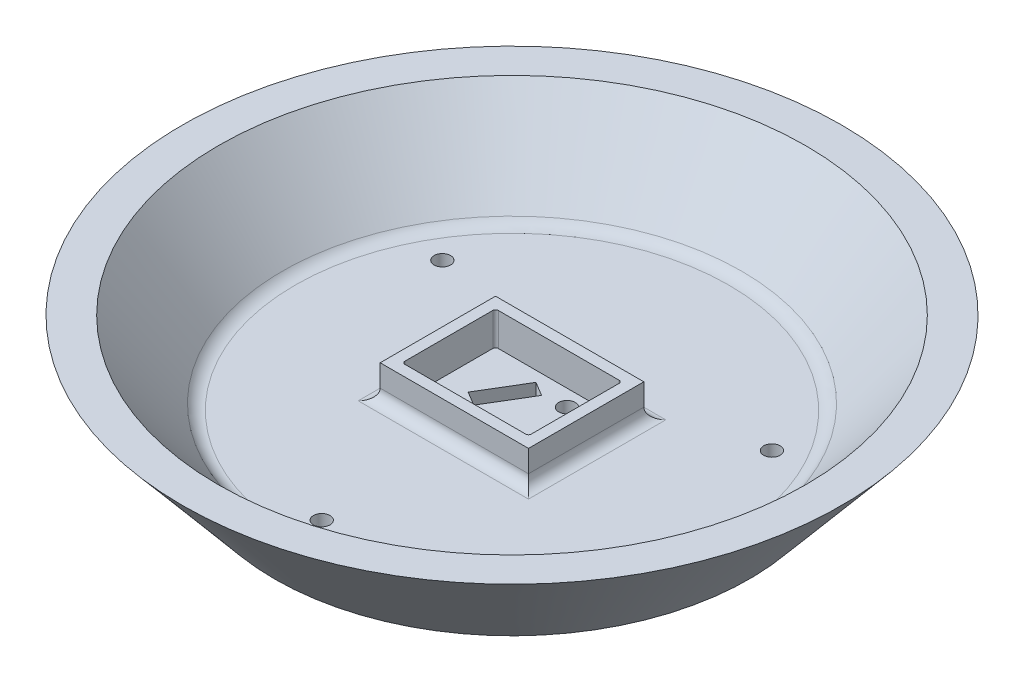
ISO-10303-21;
HEADER;
FILE_DESCRIPTION(('STEP AP214'),'2;1');
FILE_NAME('part.step','',(''),(''),'','','');
FILE_SCHEMA(('AUTOMOTIVE_DESIGN { 1 0 10303 214 1 1 1 1 }'));
ENDSEC;
DATA;
#1=APPLICATION_CONTEXT('core data for automotive mechanical design processes');
#2=APPLICATION_PROTOCOL_DEFINITION('international standard','automotive_design',2000,#1);
#3=PRODUCT_CONTEXT('',#1,'mechanical');
#4=PRODUCT('Part','Part','',(#3));
#5=PRODUCT_RELATED_PRODUCT_CATEGORY('part','',(#4));
#6=PRODUCT_DEFINITION_FORMATION('','',#4);
#7=PRODUCT_DEFINITION_CONTEXT('part definition',#1,'design');
#8=PRODUCT_DEFINITION('design','',#6,#7);
#9=PRODUCT_DEFINITION_SHAPE('','',#8);
#10=(LENGTH_UNIT() NAMED_UNIT(*) SI_UNIT(.MILLI.,.METRE.));
#11=(NAMED_UNIT(*) PLANE_ANGLE_UNIT() SI_UNIT($,.RADIAN.));
#12=(NAMED_UNIT(*) SI_UNIT($,.STERADIAN.) SOLID_ANGLE_UNIT());
#13=UNCERTAINTY_MEASURE_WITH_UNIT(LENGTH_MEASURE(1.E-05),#10,'distance_accuracy_value','');
#14=(GEOMETRIC_REPRESENTATION_CONTEXT(3) GLOBAL_UNCERTAINTY_ASSIGNED_CONTEXT((#13)) GLOBAL_UNIT_ASSIGNED_CONTEXT((#10,
#11,#12)) REPRESENTATION_CONTEXT('',''));
#15=CARTESIAN_POINT('',(0.,0.,0.));
#16=DIRECTION('',(0.,0.,1.));
#17=DIRECTION('',(1.,0.,0.));
#18=AXIS2_PLACEMENT_3D('',#15,#16,#17);
#19=CARTESIAN_POINT('',(0.,-15.,0.));
#20=DIRECTION('',(0.,1.,0.));
#21=DIRECTION('',(0.,0.,1.));
#22=AXIS2_PLACEMENT_3D('',#19,#20,#21);
#23=PLANE('',#22);
#24=CARTESIAN_POINT('',(0.,-15.,0.));
#25=DIRECTION('',(0.,1.,0.));
#26=DIRECTION('',(0.,0.,1.));
#27=AXIS2_PLACEMENT_3D('',#24,#25,#26);
#28=CIRCLE('',#27,39.4875461112144);
#29=CARTESIAN_POINT('',(0.,-15.,39.4875461112144));
#30=VERTEX_POINT('',#29);
#31=EDGE_CURVE('E43',#30,#30,#28,.T.);
#32=ORIENTED_EDGE('',*,*,#31,.T.);
#33=EDGE_LOOP('',(#32));
#34=FACE_BOUND('',#33,.T.);
#35=DIRECTION('',(0.,0.,1.));
#36=VECTOR('',#35,1.);
#37=CARTESIAN_POINT('',(-15.5,-15.,0.));
#38=LINE('',#37,#36);
#39=CARTESIAN_POINT('',(-15.5,-15.,12.5));
#40=VERTEX_POINT('',#39);
#41=CARTESIAN_POINT('',(-15.5,-15.,-12.5));
#42=VERTEX_POINT('',#41);
#43=EDGE_CURVE('E346',#40,#42,#38,.F.);
#44=ORIENTED_EDGE('',*,*,#43,.T.);
#45=DIRECTION('',(-1.,0.,0.));
#46=VECTOR('',#45,1.);
#47=CARTESIAN_POINT('',(0.,-15.,-12.5));
#48=LINE('',#47,#46);
#49=CARTESIAN_POINT('',(15.5,-15.,-12.5));
#50=VERTEX_POINT('',#49);
#51=EDGE_CURVE('E352',#42,#50,#48,.F.);
#52=ORIENTED_EDGE('',*,*,#51,.T.);
#53=DIRECTION('',(0.,0.,-1.));
#54=VECTOR('',#53,1.);
#55=CARTESIAN_POINT('',(15.5,-15.,0.));
#56=LINE('',#55,#54);
#57=CARTESIAN_POINT('',(15.5,-15.,12.5));
#58=VERTEX_POINT('',#57);
#59=EDGE_CURVE('E350',#50,#58,#56,.F.);
#60=ORIENTED_EDGE('',*,*,#59,.T.);
#61=DIRECTION('',(1.,0.,0.));
#62=VECTOR('',#61,1.);
#63=CARTESIAN_POINT('',(0.,-15.,12.5));
#64=LINE('',#63,#62);
#65=EDGE_CURVE('E348',#58,#40,#64,.F.);
#66=ORIENTED_EDGE('',*,*,#65,.T.);
#67=EDGE_LOOP('',(#44,#52,#60,#66));
#68=FACE_BOUND('',#67,.T.);
#69=CARTESIAN_POINT('',(-29.999119987093,-15.,-17.32));
#70=DIRECTION('',(0.,1.,0.));
#71=DIRECTION('',(0.,0.,1.));
#72=AXIS2_PLACEMENT_3D('',#69,#70,#71);
#73=CIRCLE('',#72,1.49999999999999);
#74=CARTESIAN_POINT('',(-29.999119987093,-15.,-15.82));
#75=VERTEX_POINT('',#74);
#76=EDGE_CURVE('E238',#75,#75,#73,.T.);
#77=ORIENTED_EDGE('',*,*,#76,.F.);
#78=EDGE_LOOP('',(#77));
#79=FACE_BOUND('',#78,.T.);
#80=CARTESIAN_POINT('',(29.999119987093,-15.,-17.32));
#81=DIRECTION('',(0.,1.,0.));
#82=DIRECTION('',(0.,0.,1.));
#83=AXIS2_PLACEMENT_3D('',#80,#81,#82);
#84=CIRCLE('',#83,1.49999999999999);
#85=CARTESIAN_POINT('',(29.999119987093,-15.,-15.82));
#86=VERTEX_POINT('',#85);
#87=EDGE_CURVE('E244',#86,#86,#84,.T.);
#88=ORIENTED_EDGE('',*,*,#87,.F.);
#89=EDGE_LOOP('',(#88));
#90=FACE_BOUND('',#89,.T.);
#91=CARTESIAN_POINT('',(0.,-15.,34.64));
#92=DIRECTION('',(0.,1.,0.));
#93=DIRECTION('',(0.,0.,1.));
#94=AXIS2_PLACEMENT_3D('',#91,#92,#93);
#95=CIRCLE('',#94,1.49999999999999);
#96=CARTESIAN_POINT('',(0.,-15.,36.14));
#97=VERTEX_POINT('',#96);
#98=EDGE_CURVE('E250',#97,#97,#95,.T.);
#99=ORIENTED_EDGE('',*,*,#98,.F.);
#100=EDGE_LOOP('',(#99));
#101=FACE_BOUND('',#100,.T.);
#102=ADVANCED_FACE('F35',(#34,#68,#79,#90,#101),#23,.T.);
#103=CARTESIAN_POINT('',(0.,0.,0.));
#104=DIRECTION('',(0.,1.,0.));
#105=DIRECTION('',(0.,0.,1.));
#106=AXIS2_PLACEMENT_3D('',#103,#104,#105);
#107=CONICAL_SURFACE('',#106,60.,0.698131700797732);
#108=CARTESIAN_POINT('',(0.,-20.,0.));
#109=DIRECTION('',(0.,1.,0.));
#110=DIRECTION('',(0.,0.,1.));
#111=AXIS2_PLACEMENT_3D('',#108,#109,#110);
#112=CIRCLE('',#111,43.2180073764544);
#113=CARTESIAN_POINT('',(0.,-20.,43.2180073764544));
#114=VERTEX_POINT('',#113);
#115=EDGE_CURVE('E340',#114,#114,#112,.T.);
#116=ORIENTED_EDGE('',*,*,#115,.T.);
#117=EDGE_LOOP('',(#116));
#118=FACE_BOUND('',#117,.T.);
#119=CARTESIAN_POINT('',(0.,0.,0.));
#120=DIRECTION('',(0.,1.,0.));
#121=DIRECTION('',(0.,0.,1.));
#122=AXIS2_PLACEMENT_3D('',#119,#120,#121);
#123=CIRCLE('',#122,60.);
#124=CARTESIAN_POINT('',(0.,0.,60.));
#125=VERTEX_POINT('',#124);
#126=EDGE_CURVE('E337',#125,#125,#123,.T.);
#127=ORIENTED_EDGE('',*,*,#126,.F.);
#128=EDGE_LOOP('',(#127));
#129=FACE_BOUND('',#128,.T.);
#130=ADVANCED_FACE('F389',(#118,#129),#107,.T.);
#131=CARTESIAN_POINT('',(0.,-20.,0.));
#132=DIRECTION('',(0.,1.,0.));
#133=DIRECTION('',(0.,0.,1.));
#134=AXIS2_PLACEMENT_3D('',#131,#132,#133);
#135=PLANE('',#134);
#136=DIRECTION('',(0.856727976668978,0.,0.515768527532147));
#137=VECTOR('',#136,1.);
#138=CARTESIAN_POINT('',(-6.87018393000693,-20.,1.1165450138147));
#139=LINE('',#138,#137);
#140=CARTESIAN_POINT('',(-6.87018393000693,-20.,1.1165450138147));
#141=VERTEX_POINT('',#140);
#142=CARTESIAN_POINT('',(-4.3,-20.,2.66385059641114));
#143=VERTEX_POINT('',#142);
#144=EDGE_CURVE('E190',#141,#143,#139,.T.);
#145=ORIENTED_EDGE('',*,*,#144,.T.);
#146=DIRECTION('',(-0.515768527532147,0.,0.856727976668978));
#147=VECTOR('',#146,1.);
#148=CARTESIAN_POINT('',(0.34191674778932,-20.,-5.04670119360966));
#149=LINE('',#148,#147);
#150=CARTESIAN_POINT('',(0.34191674778932,-20.,-5.04670119360966));
#151=VERTEX_POINT('',#150);
#152=EDGE_CURVE('E50',#151,#143,#149,.T.);
#153=ORIENTED_EDGE('',*,*,#152,.F.);
#154=DIRECTION('',(-0.856727976668977,0.,-0.515768527532148));
#155=VECTOR('',#154,1.);
#156=CARTESIAN_POINT('',(0.34191674778932,-20.,-5.04670119360966));
#157=LINE('',#156,#155);
#158=CARTESIAN_POINT('',(-2.22826718221761,-20.,-6.5940067762061));
#159=VERTEX_POINT('',#158);
#160=EDGE_CURVE('E197',#151,#159,#157,.T.);
#161=ORIENTED_EDGE('',*,*,#160,.T.);
#162=DIRECTION('',(-0.515768527532147,0.,0.856727976668978));
#163=VECTOR('',#162,1.);
#164=CARTESIAN_POINT('',(-2.22826718221761,-20.,-6.5940067762061));
#165=LINE('',#164,#163);
#166=EDGE_CURVE('E181',#159,#141,#165,.T.);
#167=ORIENTED_EDGE('',*,*,#166,.T.);
#168=EDGE_LOOP('',(#145,#153,#161,#167));
#169=FACE_BOUND('',#168,.T.);
#170=CARTESIAN_POINT('',(0.,-20.,19.));
#171=DIRECTION('',(0.,-1.,0.));
#172=DIRECTION('',(0.,0.,-1.));
#173=AXIS2_PLACEMENT_3D('',#170,#171,#172);
#174=CIRCLE('',#173,1.49999999999999);
#175=CARTESIAN_POINT('',(0.,-20.,17.5));
#176=VERTEX_POINT('',#175);
#177=EDGE_CURVE('E204',#176,#176,#174,.T.);
#178=ORIENTED_EDGE('',*,*,#177,.F.);
#179=EDGE_LOOP('',(#178));
#180=FACE_BOUND('',#179,.T.);
#181=CARTESIAN_POINT('',(16.4544826719043,-20.,-9.49999999999999));
#182=DIRECTION('',(0.,-1.,0.));
#183=DIRECTION('',(0.,0.,-1.));
#184=AXIS2_PLACEMENT_3D('',#181,#182,#183);
#185=CIRCLE('',#184,1.49999999999999);
#186=CARTESIAN_POINT('',(16.4544826719043,-20.,-11.));
#187=VERTEX_POINT('',#186);
#188=EDGE_CURVE('E212',#187,#187,#185,.T.);
#189=ORIENTED_EDGE('',*,*,#188,.F.);
#190=EDGE_LOOP('',(#189));
#191=FACE_BOUND('',#190,.T.);
#192=CARTESIAN_POINT('',(-16.4544826719043,-20.,-9.5));
#193=DIRECTION('',(0.,-1.,0.));
#194=DIRECTION('',(0.,0.,-1.));
#195=AXIS2_PLACEMENT_3D('',#192,#193,#194);
#196=CIRCLE('',#195,1.49999999999999);
#197=CARTESIAN_POINT('',(-16.4544826719043,-20.,-11.));
#198=VERTEX_POINT('',#197);
#199=EDGE_CURVE('E218',#198,#198,#196,.T.);
#200=ORIENTED_EDGE('',*,*,#199,.F.);
#201=EDGE_LOOP('',(#200));
#202=FACE_BOUND('',#201,.T.);
#203=CARTESIAN_POINT('',(4.5,-20.,-5.5));
#204=DIRECTION('',(0.,1.,0.));
#205=DIRECTION('',(0.,0.,1.));
#206=AXIS2_PLACEMENT_3D('',#203,#204,#205);
#207=CIRCLE('',#206,1.49999999999999);
#208=CARTESIAN_POINT('',(4.5,-20.,-4.00000000000001));
#209=VERTEX_POINT('',#208);
#210=EDGE_CURVE('E228',#209,#209,#207,.T.);
#211=ORIENTED_EDGE('',*,*,#210,.T.);
#212=EDGE_LOOP('',(#211));
#213=FACE_BOUND('',#212,.T.);
#214=CARTESIAN_POINT('',(4.5,-20.,6.5));
#215=DIRECTION('',(0.,1.,0.));
#216=DIRECTION('',(0.,0.,1.));
#217=AXIS2_PLACEMENT_3D('',#214,#215,#216);
#218=CIRCLE('',#217,1.49999999999999);
#219=CARTESIAN_POINT('',(4.5,-20.,7.99999999999999));
#220=VERTEX_POINT('',#219);
#221=EDGE_CURVE('E235',#220,#220,#218,.T.);
#222=ORIENTED_EDGE('',*,*,#221,.T.);
#223=EDGE_LOOP('',(#222));
#224=FACE_BOUND('',#223,.T.);
#225=ORIENTED_EDGE('',*,*,#115,.F.);
#226=EDGE_LOOP('',(#225));
#227=FACE_BOUND('',#226,.T.);
#228=ADVANCED_FACE('F194',(#169,#180,#191,#202,#213,#224,#227),#135,.F.);
#229=CARTESIAN_POINT('',(0.,0.,0.));
#230=DIRECTION('',(0.,1.,0.));
#231=DIRECTION('',(0.,0.,1.));
#232=AXIS2_PLACEMENT_3D('',#229,#230,#231);
#233=PLANE('',#232);
#234=CARTESIAN_POINT('',(0.,0.,0.));
#235=DIRECTION('',(0.,1.,0.));
#236=DIRECTION('',(0.,0.,1.));
#237=AXIS2_PLACEMENT_3D('',#234,#235,#236);
#238=CIRCLE('',#237,53.4729635533386);
#239=CARTESIAN_POINT('',(0.,0.,53.4729635533386));
#240=VERTEX_POINT('',#239);
#241=EDGE_CURVE('E334',#240,#240,#238,.T.);
#242=ORIENTED_EDGE('',*,*,#241,.F.);
#243=EDGE_LOOP('',(#242));
#244=FACE_BOUND('',#243,.T.);
#245=ORIENTED_EDGE('',*,*,#126,.T.);
#246=EDGE_LOOP('',(#245));
#247=FACE_BOUND('',#246,.T.);
#248=ADVANCED_FACE('F494',(#244,#247),#233,.T.);
#249=CARTESIAN_POINT('',(0.,3.2139380484327,0.));
#250=DIRECTION('',(0.,1.,0.));
#251=DIRECTION('',(0.,0.,1.));
#252=AXIS2_PLACEMENT_3D('',#249,#250,#251);
#253=CONICAL_SURFACE('',#252,56.1697777844051,0.698131700797732);
#254=CARTESIAN_POINT('',(0.,-13.9283628290596,0.));
#255=DIRECTION('',(0.,-1.,0.));
#256=DIRECTION('',(0.,0.,-1.));
#257=AXIS2_PLACEMENT_3D('',#254,#255,#256);
#258=CIRCLE('',#257,41.7856794405713);
#259=CARTESIAN_POINT('',(0.,-13.9283628290596,-41.7856794405713));
#260=VERTEX_POINT('',#259);
#261=EDGE_CURVE('E11',#260,#260,#258,.T.);
#262=ORIENTED_EDGE('',*,*,#261,.T.);
#263=EDGE_LOOP('',(#262));
#264=FACE_BOUND('',#263,.T.);
#265=ORIENTED_EDGE('',*,*,#241,.T.);
#266=EDGE_LOOP('',(#265));
#267=FACE_BOUND('',#266,.T.);
#268=ADVANCED_FACE('F478',(#264,#267),#253,.F.);
#269=CARTESIAN_POINT('',(0.,-9.,0.));
#270=DIRECTION('',(0.,1.,0.));
#271=DIRECTION('',(0.,0.,1.));
#272=AXIS2_PLACEMENT_3D('',#269,#270,#271);
#273=PLANE('',#272);
#274=DIRECTION('',(0.,0.,1.));
#275=VECTOR('',#274,1.);
#276=CARTESIAN_POINT('',(-13.5,-9.,-10.5));
#277=LINE('',#276,#275);
#278=CARTESIAN_POINT('',(-13.5,-9.,-10.5));
#279=VERTEX_POINT('',#278);
#280=CARTESIAN_POINT('',(-13.5,-9.,10.5));
#281=VERTEX_POINT('',#280);
#282=EDGE_CURVE('E313',#279,#281,#277,.T.);
#283=ORIENTED_EDGE('',*,*,#282,.T.);
#284=DIRECTION('',(1.,0.,0.));
#285=VECTOR('',#284,1.);
#286=CARTESIAN_POINT('',(-13.5,-9.,10.5));
#287=LINE('',#286,#285);
#288=CARTESIAN_POINT('',(13.5,-9.,10.5));
#289=VERTEX_POINT('',#288);
#290=EDGE_CURVE('E316',#281,#289,#287,.T.);
#291=ORIENTED_EDGE('',*,*,#290,.T.);
#292=DIRECTION('',(0.,0.,-1.));
#293=VECTOR('',#292,1.);
#294=CARTESIAN_POINT('',(13.5,-9.,-10.5));
#295=LINE('',#294,#293);
#296=CARTESIAN_POINT('',(13.5,-9.,-10.5));
#297=VERTEX_POINT('',#296);
#298=EDGE_CURVE('E318',#289,#297,#295,.T.);
#299=ORIENTED_EDGE('',*,*,#298,.T.);
#300=DIRECTION('',(-1.,0.,0.));
#301=VECTOR('',#300,1.);
#302=CARTESIAN_POINT('',(-13.5,-9.,-10.5));
#303=LINE('',#302,#301);
#304=EDGE_CURVE('E320',#297,#279,#303,.T.);
#305=ORIENTED_EDGE('',*,*,#304,.T.);
#306=EDGE_LOOP('',(#283,#291,#299,#305));
#307=FACE_BOUND('',#306,.T.);
#308=DIRECTION('',(1.,0.,0.));
#309=VECTOR('',#308,1.);
#310=CARTESIAN_POINT('',(-11.,-9.,8.5));
#311=LINE('',#310,#309);
#312=CARTESIAN_POINT('',(-11.,-9.,8.5));
#313=VERTEX_POINT('',#312);
#314=CARTESIAN_POINT('',(11.,-9.,8.5));
#315=VERTEX_POINT('',#314);
#316=EDGE_CURVE('E259',#313,#315,#311,.T.);
#317=ORIENTED_EDGE('',*,*,#316,.F.);
#318=CARTESIAN_POINT('',(-11.,-9.,8.));
#319=DIRECTION('',(0.,1.,0.));
#320=DIRECTION('',(0.,0.,1.));
#321=AXIS2_PLACEMENT_3D('',#318,#319,#320);
#322=CIRCLE('',#321,0.5);
#323=CARTESIAN_POINT('',(-11.5,-9.,8.));
#324=VERTEX_POINT('',#323);
#325=EDGE_CURVE('E257',#324,#313,#322,.T.);
#326=ORIENTED_EDGE('',*,*,#325,.F.);
#327=DIRECTION('',(0.,0.,1.));
#328=VECTOR('',#327,1.);
#329=CARTESIAN_POINT('',(-11.5,-9.,-7.99999999999999));
#330=LINE('',#329,#328);
#331=CARTESIAN_POINT('',(-11.5,-9.,-7.99999999999999));
#332=VERTEX_POINT('',#331);
#333=EDGE_CURVE('E273',#332,#324,#330,.T.);
#334=ORIENTED_EDGE('',*,*,#333,.F.);
#335=CARTESIAN_POINT('',(-11.,-9.,-8.));
#336=DIRECTION('',(0.,1.,0.));
#337=DIRECTION('',(0.,0.,1.));
#338=AXIS2_PLACEMENT_3D('',#335,#336,#337);
#339=CIRCLE('',#338,0.5);
#340=CARTESIAN_POINT('',(-11.,-9.,-8.5));
#341=VERTEX_POINT('',#340);
#342=EDGE_CURVE('E270',#341,#332,#339,.T.);
#343=ORIENTED_EDGE('',*,*,#342,.F.);
#344=DIRECTION('',(-1.,0.,0.));
#345=VECTOR('',#344,1.);
#346=CARTESIAN_POINT('',(-11.,-9.,-8.5));
#347=LINE('',#346,#345);
#348=CARTESIAN_POINT('',(11.,-9.,-8.5));
#349=VERTEX_POINT('',#348);
#350=EDGE_CURVE('E268',#349,#341,#347,.T.);
#351=ORIENTED_EDGE('',*,*,#350,.F.);
#352=CARTESIAN_POINT('',(11.,-9.,-8.));
#353=DIRECTION('',(0.,1.,0.));
#354=DIRECTION('',(0.,0.,-1.));
#355=AXIS2_PLACEMENT_3D('',#352,#353,#354);
#356=CIRCLE('',#355,0.5);
#357=CARTESIAN_POINT('',(11.5,-9.,-7.99999999999999));
#358=VERTEX_POINT('',#357);
#359=EDGE_CURVE('E266',#358,#349,#356,.T.);
#360=ORIENTED_EDGE('',*,*,#359,.F.);
#361=DIRECTION('',(0.,0.,-1.));
#362=VECTOR('',#361,1.);
#363=CARTESIAN_POINT('',(11.5,-9.,-7.99999999999999));
#364=LINE('',#363,#362);
#365=CARTESIAN_POINT('',(11.5,-9.,8.));
#366=VERTEX_POINT('',#365);
#367=EDGE_CURVE('E264',#366,#358,#364,.T.);
#368=ORIENTED_EDGE('',*,*,#367,.F.);
#369=CARTESIAN_POINT('',(11.,-9.,8.));
#370=DIRECTION('',(0.,1.,0.));
#371=DIRECTION('',(0.,0.,1.));
#372=AXIS2_PLACEMENT_3D('',#369,#370,#371);
#373=CIRCLE('',#372,0.5);
#374=EDGE_CURVE('E262',#315,#366,#373,.T.);
#375=ORIENTED_EDGE('',*,*,#374,.F.);
#376=EDGE_LOOP('',(#317,#326,#334,#343,#351,#360,#368,#375));
#377=FACE_BOUND('',#376,.T.);
#378=ADVANCED_FACE('F434',(#307,#377),#273,.T.);
#379=CARTESIAN_POINT('',(-13.5,-9.,-10.5));
#380=DIRECTION('',(1.,0.,0.));
#381=DIRECTION('',(0.,0.,-1.));
#382=AXIS2_PLACEMENT_3D('',#379,#380,#381);
#383=PLANE('',#382);
#384=DIRECTION('',(0.,-1.,0.));
#385=VECTOR('',#384,1.);
#386=CARTESIAN_POINT('',(-13.5,-9.,-10.5));
#387=LINE('',#386,#385);
#388=CARTESIAN_POINT('',(-13.5,-13.,-10.5));
#389=VERTEX_POINT('',#388);
#390=EDGE_CURVE('E322',#279,#389,#387,.T.);
#391=ORIENTED_EDGE('',*,*,#390,.T.);
#392=DIRECTION('',(0.,0.,1.));
#393=VECTOR('',#392,1.);
#394=CARTESIAN_POINT('',(-13.5,-13.,-10.5));
#395=LINE('',#394,#393);
#396=CARTESIAN_POINT('',(-13.5,-13.,10.5));
#397=VERTEX_POINT('',#396);
#398=EDGE_CURVE('E359',#389,#397,#395,.T.);
#399=ORIENTED_EDGE('',*,*,#398,.T.);
#400=DIRECTION('',(0.,-1.,0.));
#401=VECTOR('',#400,1.);
#402=CARTESIAN_POINT('',(-13.5,-9.,10.5));
#403=LINE('',#402,#401);
#404=EDGE_CURVE('E331',#281,#397,#403,.T.);
#405=ORIENTED_EDGE('',*,*,#404,.F.);
#406=ORIENTED_EDGE('',*,*,#282,.F.);
#407=EDGE_LOOP('',(#391,#399,#405,#406));
#408=FACE_BOUND('',#407,.T.);
#409=ADVANCED_FACE('F477',(#408),#383,.F.);
#410=CARTESIAN_POINT('',(-13.5,-9.,10.5));
#411=DIRECTION('',(0.,0.,-1.));
#412=DIRECTION('',(-1.,0.,0.));
#413=AXIS2_PLACEMENT_3D('',#410,#411,#412);
#414=PLANE('',#413);
#415=ORIENTED_EDGE('',*,*,#404,.T.);
#416=DIRECTION('',(1.,0.,0.));
#417=VECTOR('',#416,1.);
#418=CARTESIAN_POINT('',(-13.5,-13.,10.5));
#419=LINE('',#418,#417);
#420=CARTESIAN_POINT('',(13.5,-13.,10.5));
#421=VERTEX_POINT('',#420);
#422=EDGE_CURVE('E357',#397,#421,#419,.T.);
#423=ORIENTED_EDGE('',*,*,#422,.T.);
#424=DIRECTION('',(0.,-1.,0.));
#425=VECTOR('',#424,1.);
#426=CARTESIAN_POINT('',(13.5,-9.,10.5));
#427=LINE('',#426,#425);
#428=EDGE_CURVE('E328',#289,#421,#427,.T.);
#429=ORIENTED_EDGE('',*,*,#428,.F.);
#430=ORIENTED_EDGE('',*,*,#290,.F.);
#431=EDGE_LOOP('',(#415,#423,#429,#430));
#432=FACE_BOUND('',#431,.T.);
#433=ADVANCED_FACE('F486',(#432),#414,.F.);
#434=CARTESIAN_POINT('',(13.5,-9.,-10.5));
#435=DIRECTION('',(-1.,0.,0.));
#436=DIRECTION('',(0.,0.,1.));
#437=AXIS2_PLACEMENT_3D('',#434,#435,#436);
#438=PLANE('',#437);
#439=ORIENTED_EDGE('',*,*,#428,.T.);
#440=DIRECTION('',(0.,0.,-1.));
#441=VECTOR('',#440,1.);
#442=CARTESIAN_POINT('',(13.5,-13.,-10.5));
#443=LINE('',#442,#441);
#444=CARTESIAN_POINT('',(13.5,-13.,-10.5));
#445=VERTEX_POINT('',#444);
#446=EDGE_CURVE('E355',#421,#445,#443,.T.);
#447=ORIENTED_EDGE('',*,*,#446,.T.);
#448=DIRECTION('',(0.,-1.,0.));
#449=VECTOR('',#448,1.);
#450=CARTESIAN_POINT('',(13.5,-9.,-10.5));
#451=LINE('',#450,#449);
#452=EDGE_CURVE('E325',#297,#445,#451,.T.);
#453=ORIENTED_EDGE('',*,*,#452,.F.);
#454=ORIENTED_EDGE('',*,*,#298,.F.);
#455=EDGE_LOOP('',(#439,#447,#453,#454));
#456=FACE_BOUND('',#455,.T.);
#457=ADVANCED_FACE('F482',(#456),#438,.F.);
#458=CARTESIAN_POINT('',(-13.5,-9.,-10.5));
#459=DIRECTION('',(0.,0.,1.));
#460=DIRECTION('',(1.,0.,0.));
#461=AXIS2_PLACEMENT_3D('',#458,#459,#460);
#462=PLANE('',#461);
#463=ORIENTED_EDGE('',*,*,#452,.T.);
#464=DIRECTION('',(-1.,0.,0.));
#465=VECTOR('',#464,1.);
#466=CARTESIAN_POINT('',(-13.5,-13.,-10.5));
#467=LINE('',#466,#465);
#468=EDGE_CURVE('E343',#445,#389,#467,.T.);
#469=ORIENTED_EDGE('',*,*,#468,.T.);
#470=ORIENTED_EDGE('',*,*,#390,.F.);
#471=ORIENTED_EDGE('',*,*,#304,.F.);
#472=EDGE_LOOP('',(#463,#469,#470,#471));
#473=FACE_BOUND('',#472,.T.);
#474=ADVANCED_FACE('F474',(#473),#462,.F.);
#475=CARTESIAN_POINT('',(-11.,-9.,8.));
#476=DIRECTION('',(0.,-1.,0.));
#477=DIRECTION('',(0.,0.,-1.));
#478=AXIS2_PLACEMENT_3D('',#475,#476,#477);
#479=CYLINDRICAL_SURFACE('',#478,0.5);
#480=CARTESIAN_POINT('',(-11.,-15.,8.));
#481=DIRECTION('',(0.,1.,0.));
#482=DIRECTION('',(0.,0.,1.));
#483=AXIS2_PLACEMENT_3D('',#480,#481,#482);
#484=CIRCLE('',#483,0.5);
#485=CARTESIAN_POINT('',(-11.5,-15.,8.));
#486=VERTEX_POINT('',#485);
#487=CARTESIAN_POINT('',(-11.,-15.,8.5));
#488=VERTEX_POINT('',#487);
#489=EDGE_CURVE('E256',#486,#488,#484,.T.);
#490=ORIENTED_EDGE('',*,*,#489,.F.);
#491=DIRECTION('',(0.,-1.,0.));
#492=VECTOR('',#491,1.);
#493=CARTESIAN_POINT('',(-11.5,-9.,8.));
#494=LINE('',#493,#492);
#495=EDGE_CURVE('E275',#324,#486,#494,.T.);
#496=ORIENTED_EDGE('',*,*,#495,.F.);
#497=ORIENTED_EDGE('',*,*,#325,.T.);
#498=DIRECTION('',(0.,-1.,0.));
#499=VECTOR('',#498,1.);
#500=CARTESIAN_POINT('',(-11.,-9.,8.5));
#501=LINE('',#500,#499);
#502=EDGE_CURVE('E310',#313,#488,#501,.T.);
#503=ORIENTED_EDGE('',*,*,#502,.T.);
#504=EDGE_LOOP('',(#490,#496,#497,#503));
#505=FACE_BOUND('',#504,.T.);
#506=ADVANCED_FACE('F430',(#505),#479,.F.);
#507=CARTESIAN_POINT('',(-11.,-9.,8.5));
#508=DIRECTION('',(0.,0.,-1.));
#509=DIRECTION('',(-1.,0.,0.));
#510=AXIS2_PLACEMENT_3D('',#507,#508,#509);
#511=PLANE('',#510);
#512=DIRECTION('',(1.,0.,0.));
#513=VECTOR('',#512,1.);
#514=CARTESIAN_POINT('',(-11.,-15.,8.5));
#515=LINE('',#514,#513);
#516=CARTESIAN_POINT('',(11.,-15.,8.5));
#517=VERTEX_POINT('',#516);
#518=EDGE_CURVE('E277',#488,#517,#515,.T.);
#519=ORIENTED_EDGE('',*,*,#518,.F.);
#520=ORIENTED_EDGE('',*,*,#502,.F.);
#521=ORIENTED_EDGE('',*,*,#316,.T.);
#522=DIRECTION('',(0.,-1.,0.));
#523=VECTOR('',#522,1.);
#524=CARTESIAN_POINT('',(11.,-9.,8.5));
#525=LINE('',#524,#523);
#526=EDGE_CURVE('E307',#315,#517,#525,.T.);
#527=ORIENTED_EDGE('',*,*,#526,.T.);
#528=EDGE_LOOP('',(#519,#520,#521,#527));
#529=FACE_BOUND('',#528,.T.);
#530=ADVANCED_FACE('F426',(#529),#511,.T.);
#531=CARTESIAN_POINT('',(11.,-9.,8.));
#532=DIRECTION('',(0.,-1.,0.));
#533=DIRECTION('',(0.,0.,-1.));
#534=AXIS2_PLACEMENT_3D('',#531,#532,#533);
#535=CYLINDRICAL_SURFACE('',#534,0.5);
#536=CARTESIAN_POINT('',(11.,-15.,8.));
#537=DIRECTION('',(0.,1.,0.));
#538=DIRECTION('',(0.,0.,1.));
#539=AXIS2_PLACEMENT_3D('',#536,#537,#538);
#540=CIRCLE('',#539,0.5);
#541=CARTESIAN_POINT('',(11.5,-15.,8.));
#542=VERTEX_POINT('',#541);
#543=EDGE_CURVE('E279',#517,#542,#540,.T.);
#544=ORIENTED_EDGE('',*,*,#543,.F.);
#545=ORIENTED_EDGE('',*,*,#526,.F.);
#546=ORIENTED_EDGE('',*,*,#374,.T.);
#547=DIRECTION('',(0.,-1.,0.));
#548=VECTOR('',#547,1.);
#549=CARTESIAN_POINT('',(11.5,-9.,8.));
#550=LINE('',#549,#548);
#551=EDGE_CURVE('E304',#366,#542,#550,.T.);
#552=ORIENTED_EDGE('',*,*,#551,.T.);
#553=EDGE_LOOP('',(#544,#545,#546,#552));
#554=FACE_BOUND('',#553,.T.);
#555=ADVANCED_FACE('F439',(#554),#535,.F.);
#556=CARTESIAN_POINT('',(11.5,-9.,-7.99999999999999));
#557=DIRECTION('',(-1.,0.,0.));
#558=DIRECTION('',(0.,0.,1.));
#559=AXIS2_PLACEMENT_3D('',#556,#557,#558);
#560=PLANE('',#559);
#561=DIRECTION('',(0.,0.,-1.));
#562=VECTOR('',#561,1.);
#563=CARTESIAN_POINT('',(11.5,-15.,-7.99999999999999));
#564=LINE('',#563,#562);
#565=CARTESIAN_POINT('',(11.5,-15.,-7.99999999999999));
#566=VERTEX_POINT('',#565);
#567=EDGE_CURVE('E281',#542,#566,#564,.T.);
#568=ORIENTED_EDGE('',*,*,#567,.F.);
#569=ORIENTED_EDGE('',*,*,#551,.F.);
#570=ORIENTED_EDGE('',*,*,#367,.T.);
#571=DIRECTION('',(0.,-1.,0.));
#572=VECTOR('',#571,1.);
#573=CARTESIAN_POINT('',(11.5,-9.,-7.99999999999999));
#574=LINE('',#573,#572);
#575=EDGE_CURVE('E301',#358,#566,#574,.T.);
#576=ORIENTED_EDGE('',*,*,#575,.T.);
#577=EDGE_LOOP('',(#568,#569,#570,#576));
#578=FACE_BOUND('',#577,.T.);
#579=ADVANCED_FACE('F445',(#578),#560,.T.);
#580=CARTESIAN_POINT('',(11.,-9.,-8.));
#581=DIRECTION('',(0.,-1.,0.));
#582=DIRECTION('',(0.,0.,-1.));
#583=AXIS2_PLACEMENT_3D('',#580,#581,#582);
#584=CYLINDRICAL_SURFACE('',#583,0.5);
#585=CARTESIAN_POINT('',(11.,-15.,-8.));
#586=DIRECTION('',(0.,1.,0.));
#587=DIRECTION('',(0.,0.,-1.));
#588=AXIS2_PLACEMENT_3D('',#585,#586,#587);
#589=CIRCLE('',#588,0.5);
#590=CARTESIAN_POINT('',(11.,-15.,-8.5));
#591=VERTEX_POINT('',#590);
#592=EDGE_CURVE('E283',#566,#591,#589,.T.);
#593=ORIENTED_EDGE('',*,*,#592,.F.);
#594=ORIENTED_EDGE('',*,*,#575,.F.);
#595=ORIENTED_EDGE('',*,*,#359,.T.);
#596=DIRECTION('',(0.,-1.,0.));
#597=VECTOR('',#596,1.);
#598=CARTESIAN_POINT('',(11.,-9.,-8.5));
#599=LINE('',#598,#597);
#600=EDGE_CURVE('E298',#349,#591,#599,.T.);
#601=ORIENTED_EDGE('',*,*,#600,.T.);
#602=EDGE_LOOP('',(#593,#594,#595,#601));
#603=FACE_BOUND('',#602,.T.);
#604=ADVANCED_FACE('F448',(#603),#584,.F.);
#605=CARTESIAN_POINT('',(-11.,-9.,-8.5));
#606=DIRECTION('',(0.,0.,1.));
#607=DIRECTION('',(1.,0.,0.));
#608=AXIS2_PLACEMENT_3D('',#605,#606,#607);
#609=PLANE('',#608);
#610=DIRECTION('',(-1.,0.,0.));
#611=VECTOR('',#610,1.);
#612=CARTESIAN_POINT('',(-11.,-15.,-8.5));
#613=LINE('',#612,#611);
#614=CARTESIAN_POINT('',(-11.,-15.,-8.5));
#615=VERTEX_POINT('',#614);
#616=EDGE_CURVE('E285',#591,#615,#613,.T.);
#617=ORIENTED_EDGE('',*,*,#616,.F.);
#618=ORIENTED_EDGE('',*,*,#600,.F.);
#619=ORIENTED_EDGE('',*,*,#350,.T.);
#620=DIRECTION('',(0.,-1.,0.));
#621=VECTOR('',#620,1.);
#622=CARTESIAN_POINT('',(-11.,-9.,-8.5));
#623=LINE('',#622,#621);
#624=EDGE_CURVE('E295',#341,#615,#623,.T.);
#625=ORIENTED_EDGE('',*,*,#624,.T.);
#626=EDGE_LOOP('',(#617,#618,#619,#625));
#627=FACE_BOUND('',#626,.T.);
#628=ADVANCED_FACE('F453',(#627),#609,.T.);
#629=CARTESIAN_POINT('',(-11.,-9.,-8.));
#630=DIRECTION('',(0.,-1.,0.));
#631=DIRECTION('',(0.,0.,-1.));
#632=AXIS2_PLACEMENT_3D('',#629,#630,#631);
#633=CYLINDRICAL_SURFACE('',#632,0.5);
#634=CARTESIAN_POINT('',(-11.,-15.,-8.));
#635=DIRECTION('',(0.,1.,0.));
#636=DIRECTION('',(0.,0.,1.));
#637=AXIS2_PLACEMENT_3D('',#634,#635,#636);
#638=CIRCLE('',#637,0.5);
#639=CARTESIAN_POINT('',(-11.5,-15.,-7.99999999999999));
#640=VERTEX_POINT('',#639);
#641=EDGE_CURVE('E287',#615,#640,#638,.T.);
#642=ORIENTED_EDGE('',*,*,#641,.F.);
#643=ORIENTED_EDGE('',*,*,#624,.F.);
#644=ORIENTED_EDGE('',*,*,#342,.T.);
#645=DIRECTION('',(0.,-1.,0.));
#646=VECTOR('',#645,1.);
#647=CARTESIAN_POINT('',(-11.5,-9.,-7.99999999999999));
#648=LINE('',#647,#646);
#649=EDGE_CURVE('E292',#332,#640,#648,.T.);
#650=ORIENTED_EDGE('',*,*,#649,.T.);
#651=EDGE_LOOP('',(#642,#643,#644,#650));
#652=FACE_BOUND('',#651,.T.);
#653=ADVANCED_FACE('F410',(#652),#633,.F.);
#654=CARTESIAN_POINT('',(-11.5,-9.,-7.99999999999999));
#655=DIRECTION('',(1.,0.,0.));
#656=DIRECTION('',(0.,0.,-1.));
#657=AXIS2_PLACEMENT_3D('',#654,#655,#656);
#658=PLANE('',#657);
#659=DIRECTION('',(0.,0.,1.));
#660=VECTOR('',#659,1.);
#661=CARTESIAN_POINT('',(-11.5,-15.,-7.99999999999999));
#662=LINE('',#661,#660);
#663=EDGE_CURVE('E260',#640,#486,#662,.T.);
#664=ORIENTED_EDGE('',*,*,#663,.F.);
#665=ORIENTED_EDGE('',*,*,#649,.F.);
#666=ORIENTED_EDGE('',*,*,#333,.T.);
#667=ORIENTED_EDGE('',*,*,#495,.T.);
#668=EDGE_LOOP('',(#664,#665,#666,#667));
#669=FACE_BOUND('',#668,.T.);
#670=ADVANCED_FACE('F401',(#669),#658,.T.);
#671=DIRECTION('',(0.515768527532147,0.,-0.856727976668978));
#672=VECTOR('',#671,1.);
#673=CARTESIAN_POINT('',(-1.97904162610534,-15.,-1.19142529859926));
#674=LINE('',#673,#672);
#675=CARTESIAN_POINT('',(-4.3,-15.,2.66385059641114));
#676=VERTEX_POINT('',#675);
#677=CARTESIAN_POINT('',(0.34191674778932,-15.,-5.04670119360966));
#678=VERTEX_POINT('',#677);
#679=EDGE_CURVE('E375',#676,#678,#674,.T.);
#680=ORIENTED_EDGE('',*,*,#679,.F.);
#681=DIRECTION('',(-0.856727976668978,0.,-0.515768527532147));
#682=VECTOR('',#681,1.);
#683=CARTESIAN_POINT('',(-2.32095837389466,-15.,3.8552758950104));
#684=LINE('',#683,#682);
#685=CARTESIAN_POINT('',(-6.87018393000693,-15.,1.1165450138147));
#686=VERTEX_POINT('',#685);
#687=EDGE_CURVE('E361',#676,#686,#684,.T.);
#688=ORIENTED_EDGE('',*,*,#687,.T.);
#689=DIRECTION('',(0.515768527532147,0.,-0.856727976668978));
#690=VECTOR('',#689,1.);
#691=CARTESIAN_POINT('',(-4.54922555611227,-15.,-2.7387308811957));
#692=LINE('',#691,#690);
#693=CARTESIAN_POINT('',(-2.22826718221761,-15.,-6.5940067762061));
#694=VERTEX_POINT('',#693);
#695=EDGE_CURVE('E184',#686,#694,#692,.T.);
#696=ORIENTED_EDGE('',*,*,#695,.T.);
#697=DIRECTION('',(0.856727976668977,0.,0.515768527532148));
#698=VECTOR('',#697,1.);
#699=CARTESIAN_POINT('',(2.32095837389466,-15.,-3.85527589501039));
#700=LINE('',#699,#698);
#701=EDGE_CURVE('E372',#694,#678,#700,.T.);
#702=ORIENTED_EDGE('',*,*,#701,.T.);
#703=EDGE_LOOP('',(#680,#688,#696,#702));
#704=FACE_BOUND('',#703,.T.);
#705=CARTESIAN_POINT('',(4.5,-15.,-5.5));
#706=DIRECTION('',(0.,1.,0.));
#707=DIRECTION('',(0.,0.,1.));
#708=AXIS2_PLACEMENT_3D('',#705,#706,#707);
#709=CIRCLE('',#708,1.49999999999999);
#710=CARTESIAN_POINT('',(4.5,-15.,-4.00000000000001));
#711=VERTEX_POINT('',#710);
#712=EDGE_CURVE('E225',#711,#711,#709,.T.);
#713=ORIENTED_EDGE('',*,*,#712,.F.);
#714=EDGE_LOOP('',(#713));
#715=FACE_BOUND('',#714,.T.);
#716=CARTESIAN_POINT('',(4.5,-15.,6.5));
#717=DIRECTION('',(0.,1.,0.));
#718=DIRECTION('',(0.,0.,1.));
#719=AXIS2_PLACEMENT_3D('',#716,#717,#718);
#720=CIRCLE('',#719,1.49999999999999);
#721=CARTESIAN_POINT('',(4.5,-15.,7.99999999999999));
#722=VERTEX_POINT('',#721);
#723=EDGE_CURVE('E232',#722,#722,#720,.T.);
#724=ORIENTED_EDGE('',*,*,#723,.F.);
#725=EDGE_LOOP('',(#724));
#726=FACE_BOUND('',#725,.T.);
#727=ORIENTED_EDGE('',*,*,#489,.T.);
#728=ORIENTED_EDGE('',*,*,#518,.T.);
#729=ORIENTED_EDGE('',*,*,#543,.T.);
#730=ORIENTED_EDGE('',*,*,#567,.T.);
#731=ORIENTED_EDGE('',*,*,#592,.T.);
#732=ORIENTED_EDGE('',*,*,#616,.T.);
#733=ORIENTED_EDGE('',*,*,#641,.T.);
#734=ORIENTED_EDGE('',*,*,#663,.T.);
#735=EDGE_LOOP('',(#727,#728,#729,#730,#731,#732,#733,#734));
#736=FACE_BOUND('',#735,.T.);
#737=ADVANCED_FACE('F391',(#704,#715,#726,#736),#23,.T.);
#738=CARTESIAN_POINT('',(0.,-19.,34.64));
#739=DIRECTION('',(0.,1.,0.));
#740=DIRECTION('',(0.,0.,1.));
#741=AXIS2_PLACEMENT_3D('',#738,#739,#740);
#742=CONICAL_SURFACE('',#741,1.5,1.02974425867665);
#743=CARTESIAN_POINT('',(0.,-19.9012909285413,34.64));
#744=VERTEX_POINT('',#743);
#745=VERTEX_LOOP('',#744);
#746=FACE_BOUND('',#745,.T.);
#747=CARTESIAN_POINT('',(0.,-19.,34.64));
#748=DIRECTION('',(0.,1.,0.));
#749=DIRECTION('',(0.,0.,1.));
#750=AXIS2_PLACEMENT_3D('',#747,#748,#749);
#751=CIRCLE('',#750,1.5);
#752=CARTESIAN_POINT('',(0.,-19.,36.14));
#753=VERTEX_POINT('',#752);
#754=EDGE_CURVE('E253',#753,#753,#751,.T.);
#755=ORIENTED_EDGE('',*,*,#754,.T.);
#756=EDGE_LOOP('',(#755));
#757=FACE_BOUND('',#756,.T.);
#758=ADVANCED_FACE('F400',(#746,#757),#742,.F.);
#759=CARTESIAN_POINT('',(0.,-15.,34.64));
#760=DIRECTION('',(0.,1.,0.));
#761=DIRECTION('',(0.,0.,1.));
#762=AXIS2_PLACEMENT_3D('',#759,#760,#761);
#763=CYLINDRICAL_SURFACE('',#762,1.49999999999999);
#764=ORIENTED_EDGE('',*,*,#754,.F.);
#765=EDGE_LOOP('',(#764));
#766=FACE_BOUND('',#765,.T.);
#767=ORIENTED_EDGE('',*,*,#98,.T.);
#768=EDGE_LOOP('',(#767));
#769=FACE_BOUND('',#768,.T.);
#770=ADVANCED_FACE('F407',(#766,#769),#763,.F.);
#771=CARTESIAN_POINT('',(29.999119987093,-19.,-17.32));
#772=DIRECTION('',(0.,1.,0.));
#773=DIRECTION('',(0.,0.,1.));
#774=AXIS2_PLACEMENT_3D('',#771,#772,#773);
#775=CONICAL_SURFACE('',#774,1.5,1.02974425867666);
#776=CARTESIAN_POINT('',(29.999119987093,-19.9012909285413,-17.32));
#777=VERTEX_POINT('',#776);
#778=VERTEX_LOOP('',#777);
#779=FACE_BOUND('',#778,.T.);
#780=CARTESIAN_POINT('',(29.999119987093,-19.,-17.32));
#781=DIRECTION('',(0.,1.,0.));
#782=DIRECTION('',(0.,0.,1.));
#783=AXIS2_PLACEMENT_3D('',#780,#781,#782);
#784=CIRCLE('',#783,1.5);
#785=CARTESIAN_POINT('',(29.999119987093,-19.,-15.82));
#786=VERTEX_POINT('',#785);
#787=EDGE_CURVE('E247',#786,#786,#784,.T.);
#788=ORIENTED_EDGE('',*,*,#787,.T.);
#789=EDGE_LOOP('',(#788));
#790=FACE_BOUND('',#789,.T.);
#791=ADVANCED_FACE('F559',(#779,#790),#775,.F.);
#792=CARTESIAN_POINT('',(29.999119987093,-15.,-17.32));
#793=DIRECTION('',(0.,1.,0.));
#794=DIRECTION('',(0.,0.,1.));
#795=AXIS2_PLACEMENT_3D('',#792,#793,#794);
#796=CYLINDRICAL_SURFACE('',#795,1.49999999999999);
#797=ORIENTED_EDGE('',*,*,#787,.F.);
#798=EDGE_LOOP('',(#797));
#799=FACE_BOUND('',#798,.T.);
#800=ORIENTED_EDGE('',*,*,#87,.T.);
#801=EDGE_LOOP('',(#800));
#802=FACE_BOUND('',#801,.T.);
#803=ADVANCED_FACE('F565',(#799,#802),#796,.F.);
#804=CARTESIAN_POINT('',(-29.999119987093,-19.,-17.32));
#805=DIRECTION('',(0.,1.,0.));
#806=DIRECTION('',(0.,0.,1.));
#807=AXIS2_PLACEMENT_3D('',#804,#805,#806);
#808=CONICAL_SURFACE('',#807,1.5,1.02974425867665);
#809=CARTESIAN_POINT('',(-29.999119987093,-19.9012909285413,-17.32));
#810=VERTEX_POINT('',#809);
#811=VERTEX_LOOP('',#810);
#812=FACE_BOUND('',#811,.T.);
#813=CARTESIAN_POINT('',(-29.999119987093,-19.,-17.32));
#814=DIRECTION('',(0.,1.,0.));
#815=DIRECTION('',(0.,0.,1.));
#816=AXIS2_PLACEMENT_3D('',#813,#814,#815);
#817=CIRCLE('',#816,1.5);
#818=CARTESIAN_POINT('',(-29.999119987093,-19.,-15.82));
#819=VERTEX_POINT('',#818);
#820=EDGE_CURVE('E241',#819,#819,#817,.T.);
#821=ORIENTED_EDGE('',*,*,#820,.T.);
#822=EDGE_LOOP('',(#821));
#823=FACE_BOUND('',#822,.T.);
#824=ADVANCED_FACE('F572',(#812,#823),#808,.F.);
#825=CARTESIAN_POINT('',(-29.999119987093,-15.,-17.32));
#826=DIRECTION('',(0.,1.,0.));
#827=DIRECTION('',(0.,0.,1.));
#828=AXIS2_PLACEMENT_3D('',#825,#826,#827);
#829=CYLINDRICAL_SURFACE('',#828,1.49999999999999);
#830=ORIENTED_EDGE('',*,*,#820,.F.);
#831=EDGE_LOOP('',(#830));
#832=FACE_BOUND('',#831,.T.);
#833=ORIENTED_EDGE('',*,*,#76,.T.);
#834=EDGE_LOOP('',(#833));
#835=FACE_BOUND('',#834,.T.);
#836=ADVANCED_FACE('F576',(#832,#835),#829,.F.);
#837=CARTESIAN_POINT('',(4.5,-15.,6.5));
#838=DIRECTION('',(0.,1.,0.));
#839=DIRECTION('',(0.,0.,1.));
#840=AXIS2_PLACEMENT_3D('',#837,#838,#839);
#841=CYLINDRICAL_SURFACE('',#840,1.49999999999999);
#842=ORIENTED_EDGE('',*,*,#723,.T.);
#843=EDGE_LOOP('',(#842));
#844=FACE_BOUND('',#843,.T.);
#845=ORIENTED_EDGE('',*,*,#221,.F.);
#846=EDGE_LOOP('',(#845));
#847=FACE_BOUND('',#846,.T.);
#848=ADVANCED_FACE('F529',(#844,#847),#841,.F.);
#849=CARTESIAN_POINT('',(4.5,-15.,-5.5));
#850=DIRECTION('',(0.,1.,0.));
#851=DIRECTION('',(0.,0.,1.));
#852=AXIS2_PLACEMENT_3D('',#849,#850,#851);
#853=CYLINDRICAL_SURFACE('',#852,1.49999999999999);
#854=ORIENTED_EDGE('',*,*,#712,.T.);
#855=EDGE_LOOP('',(#854));
#856=FACE_BOUND('',#855,.T.);
#857=ORIENTED_EDGE('',*,*,#210,.F.);
#858=EDGE_LOOP('',(#857));
#859=FACE_BOUND('',#858,.T.);
#860=ADVANCED_FACE('F524',(#856,#859),#853,.F.);
#861=CARTESIAN_POINT('',(-13.5,-13.,12.5));
#862=DIRECTION('',(1.,0.,0.));
#863=DIRECTION('',(0.,0.,-1.));
#864=AXIS2_PLACEMENT_3D('',#861,#862,#863);
#865=CYLINDRICAL_SURFACE('',#864,2.);
#866=CARTESIAN_POINT('',(-15.5,-13.,12.5));
#867=DIRECTION('',(0.707106781186547,0.,0.707106781186547));
#868=DIRECTION('',(-0.707106781186547,0.,0.707106781186548));
#869=AXIS2_PLACEMENT_3D('',#866,#867,#868);
#870=ELLIPSE('',#869,2.82842712474619,2.);
#871=EDGE_CURVE('E365',#40,#397,#870,.T.);
#872=ORIENTED_EDGE('',*,*,#871,.F.);
#873=ORIENTED_EDGE('',*,*,#65,.F.);
#874=CARTESIAN_POINT('',(15.5,-13.,12.5));
#875=DIRECTION('',(0.707106781186547,0.,-0.707106781186548));
#876=DIRECTION('',(0.707106781186548,0.,0.707106781186547));
#877=AXIS2_PLACEMENT_3D('',#874,#875,#876);
#878=ELLIPSE('',#877,2.82842712474619,2.);
#879=EDGE_CURVE('E229',#421,#58,#878,.F.);
#880=ORIENTED_EDGE('',*,*,#879,.F.);
#881=ORIENTED_EDGE('',*,*,#422,.F.);
#882=EDGE_LOOP('',(#872,#873,#880,#881));
#883=FACE_BOUND('',#882,.T.);
#884=ADVANCED_FACE('F521',(#883),#865,.F.);
#885=CARTESIAN_POINT('',(15.5,-13.,-10.5));
#886=DIRECTION('',(0.,0.,-1.));
#887=DIRECTION('',(-1.,0.,0.));
#888=AXIS2_PLACEMENT_3D('',#885,#886,#887);
#889=CYLINDRICAL_SURFACE('',#888,2.);
#890=ORIENTED_EDGE('',*,*,#879,.T.);
#891=ORIENTED_EDGE('',*,*,#59,.F.);
#892=CARTESIAN_POINT('',(15.5,-13.,-12.5));
#893=DIRECTION('',(-0.707106781186548,0.,-0.707106781186547));
#894=DIRECTION('',(0.707106781186547,0.,-0.707106781186548));
#895=AXIS2_PLACEMENT_3D('',#892,#893,#894);
#896=ELLIPSE('',#895,2.82842712474619,2.);
#897=EDGE_CURVE('E363',#445,#50,#896,.F.);
#898=ORIENTED_EDGE('',*,*,#897,.F.);
#899=ORIENTED_EDGE('',*,*,#446,.F.);
#900=EDGE_LOOP('',(#890,#891,#898,#899));
#901=FACE_BOUND('',#900,.T.);
#902=ADVANCED_FACE('F518',(#901),#889,.F.);
#903=CARTESIAN_POINT('',(-15.5,-13.,-10.5));
#904=DIRECTION('',(0.,0.,1.));
#905=DIRECTION('',(1.,0.,0.));
#906=AXIS2_PLACEMENT_3D('',#903,#904,#905);
#907=CYLINDRICAL_SURFACE('',#906,2.);
#908=ORIENTED_EDGE('',*,*,#871,.T.);
#909=ORIENTED_EDGE('',*,*,#398,.F.);
#910=CARTESIAN_POINT('',(-15.5,-13.,-12.5));
#911=DIRECTION('',(-0.707106781186547,0.,0.707106781186548));
#912=DIRECTION('',(0.707106781186547,0.,0.707106781186547));
#913=AXIS2_PLACEMENT_3D('',#910,#911,#912);
#914=ELLIPSE('',#913,2.82842712474619,2.);
#915=EDGE_CURVE('E224',#42,#389,#914,.T.);
#916=ORIENTED_EDGE('',*,*,#915,.F.);
#917=ORIENTED_EDGE('',*,*,#43,.F.);
#918=EDGE_LOOP('',(#908,#909,#916,#917));
#919=FACE_BOUND('',#918,.T.);
#920=ADVANCED_FACE('F514',(#919),#907,.F.);
#921=CARTESIAN_POINT('',(-13.5,-13.,-12.5));
#922=DIRECTION('',(-1.,0.,0.));
#923=DIRECTION('',(0.,0.,1.));
#924=AXIS2_PLACEMENT_3D('',#921,#922,#923);
#925=CYLINDRICAL_SURFACE('',#924,2.);
#926=ORIENTED_EDGE('',*,*,#897,.T.);
#927=ORIENTED_EDGE('',*,*,#51,.F.);
#928=ORIENTED_EDGE('',*,*,#915,.T.);
#929=ORIENTED_EDGE('',*,*,#468,.F.);
#930=EDGE_LOOP('',(#926,#927,#928,#929));
#931=FACE_BOUND('',#930,.T.);
#932=ADVANCED_FACE('F510',(#931),#925,.F.);
#933=CARTESIAN_POINT('',(-16.4544826719043,-16.,-9.5));
#934=DIRECTION('',(0.,-1.,0.));
#935=DIRECTION('',(0.,0.,-1.));
#936=AXIS2_PLACEMENT_3D('',#933,#934,#935);
#937=CONICAL_SURFACE('',#936,1.49999999999999,1.02974425867665);
#938=CARTESIAN_POINT('',(-16.4544826719043,-15.0987090714587,-9.5));
#939=VERTEX_POINT('',#938);
#940=VERTEX_LOOP('',#939);
#941=FACE_BOUND('',#940,.T.);
#942=CARTESIAN_POINT('',(-16.4544826719043,-16.,-9.5));
#943=DIRECTION('',(0.,-1.,0.));
#944=DIRECTION('',(0.,0.,-1.));
#945=AXIS2_PLACEMENT_3D('',#942,#943,#944);
#946=CIRCLE('',#945,1.49999999999999);
#947=CARTESIAN_POINT('',(-16.4544826719043,-16.,-11.));
#948=VERTEX_POINT('',#947);
#949=EDGE_CURVE('E221',#948,#948,#946,.T.);
#950=ORIENTED_EDGE('',*,*,#949,.T.);
#951=EDGE_LOOP('',(#950));
#952=FACE_BOUND('',#951,.T.);
#953=ADVANCED_FACE('F513',(#941,#952),#937,.F.);
#954=CARTESIAN_POINT('',(-16.4544826719043,-20.,-9.5));
#955=DIRECTION('',(0.,-1.,0.));
#956=DIRECTION('',(0.,0.,-1.));
#957=AXIS2_PLACEMENT_3D('',#954,#955,#956);
#958=CYLINDRICAL_SURFACE('',#957,1.49999999999999);
#959=ORIENTED_EDGE('',*,*,#949,.F.);
#960=EDGE_LOOP('',(#959));
#961=FACE_BOUND('',#960,.T.);
#962=ORIENTED_EDGE('',*,*,#199,.T.);
#963=EDGE_LOOP('',(#962));
#964=FACE_BOUND('',#963,.T.);
#965=ADVANCED_FACE('F586',(#961,#964),#958,.F.);
#966=CARTESIAN_POINT('',(16.4544826719043,-16.,-9.49999999999999));
#967=DIRECTION('',(0.,-1.,0.));
#968=DIRECTION('',(0.,0.,-1.));
#969=AXIS2_PLACEMENT_3D('',#966,#967,#968);
#970=CONICAL_SURFACE('',#969,1.49999999999999,1.02974425867665);
#971=CARTESIAN_POINT('',(16.4544826719043,-15.0987090714587,-9.49999999999999));
#972=VERTEX_POINT('',#971);
#973=VERTEX_LOOP('',#972);
#974=FACE_BOUND('',#973,.T.);
#975=CARTESIAN_POINT('',(16.4544826719043,-16.,-9.49999999999999));
#976=DIRECTION('',(0.,-1.,0.));
#977=DIRECTION('',(0.,0.,-1.));
#978=AXIS2_PLACEMENT_3D('',#975,#976,#977);
#979=CIRCLE('',#978,1.49999999999999);
#980=CARTESIAN_POINT('',(16.4544826719043,-16.,-11.));
#981=VERTEX_POINT('',#980);
#982=EDGE_CURVE('E215',#981,#981,#979,.T.);
#983=ORIENTED_EDGE('',*,*,#982,.T.);
#984=EDGE_LOOP('',(#983));
#985=FACE_BOUND('',#984,.T.);
#986=ADVANCED_FACE('F590',(#974,#985),#970,.F.);
#987=CARTESIAN_POINT('',(16.4544826719043,-20.,-9.49999999999999));
#988=DIRECTION('',(0.,-1.,0.));
#989=DIRECTION('',(0.,0.,-1.));
#990=AXIS2_PLACEMENT_3D('',#987,#988,#989);
#991=CYLINDRICAL_SURFACE('',#990,1.49999999999999);
#992=ORIENTED_EDGE('',*,*,#982,.F.);
#993=EDGE_LOOP('',(#992));
#994=FACE_BOUND('',#993,.T.);
#995=ORIENTED_EDGE('',*,*,#188,.T.);
#996=EDGE_LOOP('',(#995));
#997=FACE_BOUND('',#996,.T.);
#998=ADVANCED_FACE('F594',(#994,#997),#991,.F.);
#999=CARTESIAN_POINT('',(0.,-16.,19.));
#1000=DIRECTION('',(0.,-1.,0.));
#1001=DIRECTION('',(0.,0.,-1.));
#1002=AXIS2_PLACEMENT_3D('',#999,#1000,#1001);
#1003=CONICAL_SURFACE('',#1002,1.49999999999999,1.02974425867665);
#1004=CARTESIAN_POINT('',(0.,-15.0987090714587,19.));
#1005=VERTEX_POINT('',#1004);
#1006=VERTEX_LOOP('',#1005);
#1007=FACE_BOUND('',#1006,.T.);
#1008=CARTESIAN_POINT('',(0.,-16.,19.));
#1009=DIRECTION('',(0.,-1.,0.));
#1010=DIRECTION('',(0.,0.,-1.));
#1011=AXIS2_PLACEMENT_3D('',#1008,#1009,#1010);
#1012=CIRCLE('',#1011,1.49999999999999);
#1013=CARTESIAN_POINT('',(0.,-16.,17.5));
#1014=VERTEX_POINT('',#1013);
#1015=EDGE_CURVE('E209',#1014,#1014,#1012,.T.);
#1016=ORIENTED_EDGE('',*,*,#1015,.T.);
#1017=EDGE_LOOP('',(#1016));
#1018=FACE_BOUND('',#1017,.T.);
#1019=ADVANCED_FACE('F598',(#1007,#1018),#1003,.F.);
#1020=CARTESIAN_POINT('',(0.,-20.,19.));
#1021=DIRECTION('',(0.,-1.,0.));
#1022=DIRECTION('',(0.,0.,-1.));
#1023=AXIS2_PLACEMENT_3D('',#1020,#1021,#1022);
#1024=CYLINDRICAL_SURFACE('',#1023,1.49999999999999);
#1025=ORIENTED_EDGE('',*,*,#1015,.F.);
#1026=EDGE_LOOP('',(#1025));
#1027=FACE_BOUND('',#1026,.T.);
#1028=ORIENTED_EDGE('',*,*,#177,.T.);
#1029=EDGE_LOOP('',(#1028));
#1030=FACE_BOUND('',#1029,.T.);
#1031=ADVANCED_FACE('F602',(#1027,#1030),#1024,.F.);
#1032=CARTESIAN_POINT('',(0.34191674778932,-10.,-5.04670119360966));
#1033=DIRECTION('',(0.856727976668978,0.,0.515768527532147));
#1034=DIRECTION('',(0.515768527532147,0.,-0.856727976668978));
#1035=AXIS2_PLACEMENT_3D('',#1032,#1033,#1034);
#1036=PLANE('',#1035);
#1037=ORIENTED_EDGE('',*,*,#679,.T.);
#1038=DIRECTION('',(0.,-1.,0.));
#1039=VECTOR('',#1038,1.);
#1040=CARTESIAN_POINT('',(0.34191674778932,-10.,-5.04670119360966));
#1041=LINE('',#1040,#1039);
#1042=EDGE_CURVE('E202',#678,#151,#1041,.T.);
#1043=ORIENTED_EDGE('',*,*,#1042,.T.);
#1044=ORIENTED_EDGE('',*,*,#152,.T.);
#1045=DIRECTION('',(0.,-1.,0.));
#1046=VECTOR('',#1045,1.);
#1047=CARTESIAN_POINT('',(-4.3,-10.,2.66385059641114));
#1048=LINE('',#1047,#1046);
#1049=EDGE_CURVE('E187',#676,#143,#1048,.T.);
#1050=ORIENTED_EDGE('',*,*,#1049,.F.);
#1051=EDGE_LOOP('',(#1037,#1043,#1044,#1050));
#1052=FACE_BOUND('',#1051,.T.);
#1053=ADVANCED_FACE('F606',(#1052),#1036,.F.);
#1054=CARTESIAN_POINT('',(0.34191674778932,-10.,-5.04670119360966));
#1055=DIRECTION('',(-0.515768527532148,0.,0.856727976668977));
#1056=DIRECTION('',(0.856727976668977,0.,0.515768527532148));
#1057=AXIS2_PLACEMENT_3D('',#1054,#1055,#1056);
#1058=PLANE('',#1057);
#1059=DIRECTION('',(0.,-1.,0.));
#1060=VECTOR('',#1059,1.);
#1061=CARTESIAN_POINT('',(-2.22826718221761,-10.,-6.5940067762061));
#1062=LINE('',#1061,#1060);
#1063=EDGE_CURVE('E186',#694,#159,#1062,.T.);
#1064=ORIENTED_EDGE('',*,*,#1063,.T.);
#1065=ORIENTED_EDGE('',*,*,#160,.F.);
#1066=ORIENTED_EDGE('',*,*,#1042,.F.);
#1067=ORIENTED_EDGE('',*,*,#701,.F.);
#1068=EDGE_LOOP('',(#1064,#1065,#1066,#1067));
#1069=FACE_BOUND('',#1068,.T.);
#1070=ADVANCED_FACE('F609',(#1069),#1058,.T.);
#1071=CARTESIAN_POINT('',(-2.22826718221761,-10.,-6.5940067762061));
#1072=DIRECTION('',(0.856727976668978,0.,0.515768527532147));
#1073=DIRECTION('',(0.515768527532147,0.,-0.856727976668978));
#1074=AXIS2_PLACEMENT_3D('',#1071,#1072,#1073);
#1075=PLANE('',#1074);
#1076=DIRECTION('',(0.,-1.,0.));
#1077=VECTOR('',#1076,1.);
#1078=CARTESIAN_POINT('',(-6.87018393000693,-10.,1.1165450138147));
#1079=LINE('',#1078,#1077);
#1080=EDGE_CURVE('E58',#686,#141,#1079,.T.);
#1081=ORIENTED_EDGE('',*,*,#1080,.T.);
#1082=ORIENTED_EDGE('',*,*,#166,.F.);
#1083=ORIENTED_EDGE('',*,*,#1063,.F.);
#1084=ORIENTED_EDGE('',*,*,#695,.F.);
#1085=EDGE_LOOP('',(#1081,#1082,#1083,#1084));
#1086=FACE_BOUND('',#1085,.T.);
#1087=ADVANCED_FACE('F178',(#1086),#1075,.T.);
#1088=CARTESIAN_POINT('',(-6.87018393000693,-10.,1.1165450138147));
#1089=DIRECTION('',(0.515768527532147,0.,-0.856727976668978));
#1090=DIRECTION('',(-0.856727976668978,0.,-0.515768527532147));
#1091=AXIS2_PLACEMENT_3D('',#1088,#1089,#1090);
#1092=PLANE('',#1091);
#1093=ORIENTED_EDGE('',*,*,#1049,.T.);
#1094=ORIENTED_EDGE('',*,*,#144,.F.);
#1095=ORIENTED_EDGE('',*,*,#1080,.F.);
#1096=ORIENTED_EDGE('',*,*,#687,.F.);
#1097=EDGE_LOOP('',(#1093,#1094,#1095,#1096));
#1098=FACE_BOUND('',#1097,.T.);
#1099=ADVANCED_FACE('F191',(#1098),#1092,.T.);
#1100=CARTESIAN_POINT('',(0.,-12.,0.));
#1101=DIRECTION('',(0.,1.,0.));
#1102=DIRECTION('',(0.,0.,1.));
#1103=AXIS2_PLACEMENT_3D('',#1100,#1101,#1102);
#1104=TOROIDAL_SURFACE('',#1103,39.4875461112144,3.);
#1105=ORIENTED_EDGE('',*,*,#261,.F.);
#1106=EDGE_LOOP('',(#1105));
#1107=FACE_BOUND('',#1106,.T.);
#1108=ORIENTED_EDGE('',*,*,#31,.F.);
#1109=EDGE_LOOP('',(#1108));
#1110=FACE_BOUND('',#1109,.T.);
#1111=ADVANCED_FACE('F37',(#1107,#1110),#1104,.F.);
#1112=CLOSED_SHELL('',(#102,#130,#228,#248,#268,#378,#409,#433,#457,#474,#506,#530,#555,#579,
#604,#628,#653,#670,#737,#758,#770,#791,#803,#824,#836,#848,#860,#884,#902,#920,#932,#953,#965,
#986,#998,#1019,#1031,#1053,#1070,#1087,#1099,#1111));
#1113=MANIFOLD_SOLID_BREP('B2',#1112);
#1114=ADVANCED_BREP_SHAPE_REPRESENTATION('',(#18,#1113),#14);
#1115=SHAPE_DEFINITION_REPRESENTATION(#9,#1114);
ENDSEC;
END-ISO-10303-21;
